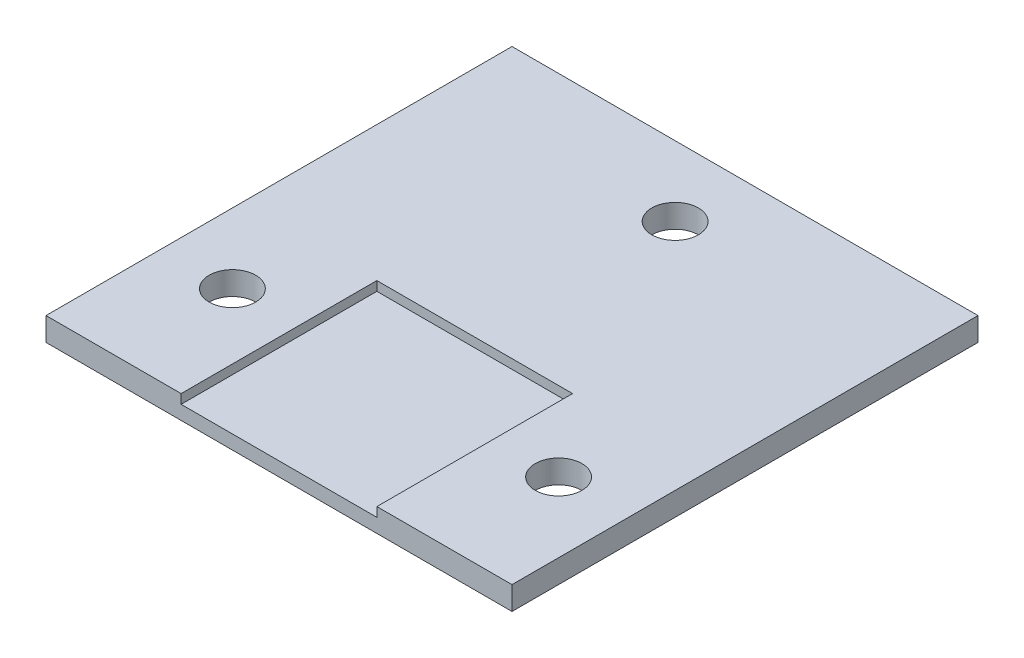
ISO-10303-21;
HEADER;
FILE_DESCRIPTION(('STEP AP214'),'2;1');
FILE_NAME('part.step','',(''),(''),'','','');
FILE_SCHEMA(('AUTOMOTIVE_DESIGN { 1 0 10303 214 1 1 1 1 }'));
ENDSEC;
DATA;
#1=APPLICATION_CONTEXT('core data for automotive mechanical design processes');
#2=APPLICATION_PROTOCOL_DEFINITION('international standard','automotive_design',2000,#1);
#3=PRODUCT_CONTEXT('',#1,'mechanical');
#4=PRODUCT('Part','Part','',(#3));
#5=PRODUCT_RELATED_PRODUCT_CATEGORY('part','',(#4));
#6=PRODUCT_DEFINITION_FORMATION('','',#4);
#7=PRODUCT_DEFINITION_CONTEXT('part definition',#1,'design');
#8=PRODUCT_DEFINITION('design','',#6,#7);
#9=PRODUCT_DEFINITION_SHAPE('','',#8);
#10=(LENGTH_UNIT() NAMED_UNIT(*) SI_UNIT(.MILLI.,.METRE.));
#11=(NAMED_UNIT(*) PLANE_ANGLE_UNIT() SI_UNIT($,.RADIAN.));
#12=(NAMED_UNIT(*) SI_UNIT($,.STERADIAN.) SOLID_ANGLE_UNIT());
#13=UNCERTAINTY_MEASURE_WITH_UNIT(LENGTH_MEASURE(1.E-05),#10,'distance_accuracy_value','');
#14=(GEOMETRIC_REPRESENTATION_CONTEXT(3) GLOBAL_UNCERTAINTY_ASSIGNED_CONTEXT((#13)) GLOBAL_UNIT_ASSIGNED_CONTEXT((#10,
#11,#12)) REPRESENTATION_CONTEXT('',''));
#15=CARTESIAN_POINT('',(0.,0.,0.));
#16=DIRECTION('',(0.,0.,1.));
#17=DIRECTION('',(1.,0.,0.));
#18=AXIS2_PLACEMENT_3D('',#15,#16,#17);
#19=CARTESIAN_POINT('',(50.,5.,50.));
#20=DIRECTION('',(-1.,0.,0.));
#21=DIRECTION('',(0.,0.,1.));
#22=AXIS2_PLACEMENT_3D('',#19,#20,#21);
#23=PLANE('',#22);
#24=DIRECTION('',(0.,0.,-1.));
#25=VECTOR('',#24,1.);
#26=CARTESIAN_POINT('',(50.,0.,50.));
#27=LINE('',#26,#25);
#28=CARTESIAN_POINT('',(50.,0.,50.));
#29=VERTEX_POINT('',#28);
#30=CARTESIAN_POINT('',(50.,0.,-50.));
#31=VERTEX_POINT('',#30);
#32=EDGE_CURVE('E157',#29,#31,#27,.T.);
#33=ORIENTED_EDGE('',*,*,#32,.T.);
#34=DIRECTION('',(0.,-1.,0.));
#35=VECTOR('',#34,1.);
#36=CARTESIAN_POINT('',(50.,5.,-50.));
#37=LINE('',#36,#35);
#38=CARTESIAN_POINT('',(50.,5.,-50.));
#39=VERTEX_POINT('',#38);
#40=EDGE_CURVE('E11',#39,#31,#37,.T.);
#41=ORIENTED_EDGE('',*,*,#40,.F.);
#42=DIRECTION('',(0.,0.,-1.));
#43=VECTOR('',#42,1.);
#44=CARTESIAN_POINT('',(50.,5.,50.));
#45=LINE('',#44,#43);
#46=CARTESIAN_POINT('',(50.,5.,50.));
#47=VERTEX_POINT('',#46);
#48=EDGE_CURVE('E164',#47,#39,#45,.T.);
#49=ORIENTED_EDGE('',*,*,#48,.F.);
#50=DIRECTION('',(0.,-1.,0.));
#51=VECTOR('',#50,1.);
#52=CARTESIAN_POINT('',(50.,5.,50.));
#53=LINE('',#52,#51);
#54=EDGE_CURVE('E176',#47,#29,#53,.T.);
#55=ORIENTED_EDGE('',*,*,#54,.T.);
#56=EDGE_LOOP('',(#33,#41,#49,#55));
#57=FACE_BOUND('',#56,.T.);
#58=ADVANCED_FACE('F39',(#57),#23,.F.);
#59=CARTESIAN_POINT('',(-50.,5.,-50.));
#60=DIRECTION('',(0.,0.,1.));
#61=DIRECTION('',(1.,0.,0.));
#62=AXIS2_PLACEMENT_3D('',#59,#60,#61);
#63=PLANE('',#62);
#64=DIRECTION('',(-1.,0.,0.));
#65=VECTOR('',#64,1.);
#66=CARTESIAN_POINT('',(-50.,0.,-50.));
#67=LINE('',#66,#65);
#68=CARTESIAN_POINT('',(-50.,0.,-50.));
#69=VERTEX_POINT('',#68);
#70=EDGE_CURVE('E180',#31,#69,#67,.T.);
#71=ORIENTED_EDGE('',*,*,#70,.T.);
#72=DIRECTION('',(0.,-1.,0.));
#73=VECTOR('',#72,1.);
#74=CARTESIAN_POINT('',(-50.,5.,-50.));
#75=LINE('',#74,#73);
#76=CARTESIAN_POINT('',(-50.,5.,-50.));
#77=VERTEX_POINT('',#76);
#78=EDGE_CURVE('E47',#77,#69,#75,.T.);
#79=ORIENTED_EDGE('',*,*,#78,.F.);
#80=DIRECTION('',(-1.,0.,0.));
#81=VECTOR('',#80,1.);
#82=CARTESIAN_POINT('',(-50.,5.,-50.));
#83=LINE('',#82,#81);
#84=EDGE_CURVE('E91',#39,#77,#83,.T.);
#85=ORIENTED_EDGE('',*,*,#84,.F.);
#86=ORIENTED_EDGE('',*,*,#40,.T.);
#87=EDGE_LOOP('',(#71,#79,#85,#86));
#88=FACE_BOUND('',#87,.T.);
#89=ADVANCED_FACE('F222',(#88),#63,.F.);
#90=CARTESIAN_POINT('',(-50.,5.,50.));
#91=DIRECTION('',(1.,0.,0.));
#92=DIRECTION('',(0.,0.,-1.));
#93=AXIS2_PLACEMENT_3D('',#90,#91,#92);
#94=PLANE('',#93);
#95=DIRECTION('',(0.,0.,1.));
#96=VECTOR('',#95,1.);
#97=CARTESIAN_POINT('',(-50.,0.,50.));
#98=LINE('',#97,#96);
#99=CARTESIAN_POINT('',(-50.,0.,50.));
#100=VERTEX_POINT('',#99);
#101=EDGE_CURVE('E183',#69,#100,#98,.T.);
#102=ORIENTED_EDGE('',*,*,#101,.T.);
#103=DIRECTION('',(0.,-1.,0.));
#104=VECTOR('',#103,1.);
#105=CARTESIAN_POINT('',(-50.,5.,50.));
#106=LINE('',#105,#104);
#107=CARTESIAN_POINT('',(-50.,5.,50.));
#108=VERTEX_POINT('',#107);
#109=EDGE_CURVE('E190',#108,#100,#106,.T.);
#110=ORIENTED_EDGE('',*,*,#109,.F.);
#111=DIRECTION('',(0.,0.,1.));
#112=VECTOR('',#111,1.);
#113=CARTESIAN_POINT('',(-50.,5.,50.));
#114=LINE('',#113,#112);
#115=EDGE_CURVE('E169',#77,#108,#114,.T.);
#116=ORIENTED_EDGE('',*,*,#115,.F.);
#117=ORIENTED_EDGE('',*,*,#78,.T.);
#118=EDGE_LOOP('',(#102,#110,#116,#117));
#119=FACE_BOUND('',#118,.T.);
#120=ADVANCED_FACE('F197',(#119),#94,.F.);
#121=CARTESIAN_POINT('',(-50.,5.,50.));
#122=DIRECTION('',(0.,0.,-1.));
#123=DIRECTION('',(-1.,0.,0.));
#124=AXIS2_PLACEMENT_3D('',#121,#122,#123);
#125=PLANE('',#124);
#126=DIRECTION('',(1.,0.,0.));
#127=VECTOR('',#126,1.);
#128=CARTESIAN_POINT('',(-50.,5.,50.));
#129=LINE('',#128,#127);
#130=CARTESIAN_POINT('',(21.,5.,50.));
#131=VERTEX_POINT('',#130);
#132=EDGE_CURVE('E62',#131,#47,#129,.T.);
#133=ORIENTED_EDGE('',*,*,#132,.F.);
#134=DIRECTION('',(0.,1.,0.));
#135=VECTOR('',#134,1.);
#136=CARTESIAN_POINT('',(21.,3.,50.));
#137=LINE('',#136,#135);
#138=CARTESIAN_POINT('',(21.,3.,50.));
#139=VERTEX_POINT('',#138);
#140=EDGE_CURVE('E154',#139,#131,#137,.T.);
#141=ORIENTED_EDGE('',*,*,#140,.F.);
#142=DIRECTION('',(1.,0.,0.));
#143=VECTOR('',#142,1.);
#144=CARTESIAN_POINT('',(-21.,3.,50.));
#145=LINE('',#144,#143);
#146=CARTESIAN_POINT('',(-21.,3.,50.));
#147=VERTEX_POINT('',#146);
#148=EDGE_CURVE('E121',#147,#139,#145,.T.);
#149=ORIENTED_EDGE('',*,*,#148,.F.);
#150=DIRECTION('',(0.,1.,0.));
#151=VECTOR('',#150,1.);
#152=CARTESIAN_POINT('',(-21.,3.,50.));
#153=LINE('',#152,#151);
#154=CARTESIAN_POINT('',(-21.,5.,50.));
#155=VERTEX_POINT('',#154);
#156=EDGE_CURVE('E158',#147,#155,#153,.T.);
#157=ORIENTED_EDGE('',*,*,#156,.T.);
#158=EDGE_CURVE('E172',#108,#155,#129,.T.);
#159=ORIENTED_EDGE('',*,*,#158,.F.);
#160=ORIENTED_EDGE('',*,*,#109,.T.);
#161=DIRECTION('',(1.,0.,0.));
#162=VECTOR('',#161,1.);
#163=CARTESIAN_POINT('',(-50.,0.,50.));
#164=LINE('',#163,#162);
#165=EDGE_CURVE('E84',#100,#29,#164,.T.);
#166=ORIENTED_EDGE('',*,*,#165,.T.);
#167=ORIENTED_EDGE('',*,*,#54,.F.);
#168=EDGE_LOOP('',(#133,#141,#149,#157,#159,#160,#166,#167));
#169=FACE_BOUND('',#168,.T.);
#170=ADVANCED_FACE('F205',(#169),#125,.F.);
#171=CARTESIAN_POINT('',(0.,5.,0.));
#172=DIRECTION('',(0.,-1.,0.));
#173=DIRECTION('',(0.,0.,-1.));
#174=AXIS2_PLACEMENT_3D('',#171,#172,#173);
#175=PLANE('',#174);
#176=CARTESIAN_POINT('',(0.,5.,-35.));
#177=DIRECTION('',(0.,1.,0.));
#178=DIRECTION('',(0.,0.,1.));
#179=AXIS2_PLACEMENT_3D('',#176,#177,#178);
#180=CIRCLE('',#179,5.);
#181=CARTESIAN_POINT('',(0.,5.,-30.));
#182=VERTEX_POINT('',#181);
#183=EDGE_CURVE('E243',#182,#182,#180,.T.);
#184=ORIENTED_EDGE('',*,*,#183,.F.);
#185=EDGE_LOOP('',(#184));
#186=FACE_BOUND('',#185,.T.);
#187=CARTESIAN_POINT('',(35.,5.,25.));
#188=DIRECTION('',(0.,1.,0.));
#189=DIRECTION('',(0.,0.,1.));
#190=AXIS2_PLACEMENT_3D('',#187,#188,#189);
#191=CIRCLE('',#190,5.);
#192=CARTESIAN_POINT('',(35.,5.,30.));
#193=VERTEX_POINT('',#192);
#194=EDGE_CURVE('E247',#193,#193,#191,.T.);
#195=ORIENTED_EDGE('',*,*,#194,.F.);
#196=EDGE_LOOP('',(#195));
#197=FACE_BOUND('',#196,.T.);
#198=CARTESIAN_POINT('',(-35.,5.,25.));
#199=DIRECTION('',(0.,1.,0.));
#200=DIRECTION('',(0.,0.,1.));
#201=AXIS2_PLACEMENT_3D('',#198,#199,#200);
#202=CIRCLE('',#201,5.);
#203=CARTESIAN_POINT('',(-35.,5.,30.));
#204=VERTEX_POINT('',#203);
#205=EDGE_CURVE('E250',#204,#204,#202,.T.);
#206=ORIENTED_EDGE('',*,*,#205,.F.);
#207=EDGE_LOOP('',(#206));
#208=FACE_BOUND('',#207,.T.);
#209=DIRECTION('',(-1.,0.,0.));
#210=VECTOR('',#209,1.);
#211=CARTESIAN_POINT('',(-21.,5.,7.99999999999999));
#212=LINE('',#211,#210);
#213=CARTESIAN_POINT('',(21.,5.,7.99999999999999));
#214=VERTEX_POINT('',#213);
#215=CARTESIAN_POINT('',(-21.,5.,7.99999999999999));
#216=VERTEX_POINT('',#215);
#217=EDGE_CURVE('E139',#214,#216,#212,.T.);
#218=ORIENTED_EDGE('',*,*,#217,.F.);
#219=DIRECTION('',(0.,0.,-1.));
#220=VECTOR('',#219,1.);
#221=CARTESIAN_POINT('',(21.,5.,7.99999999999999));
#222=LINE('',#221,#220);
#223=EDGE_CURVE('E54',#131,#214,#222,.T.);
#224=ORIENTED_EDGE('',*,*,#223,.F.);
#225=ORIENTED_EDGE('',*,*,#132,.T.);
#226=ORIENTED_EDGE('',*,*,#48,.T.);
#227=ORIENTED_EDGE('',*,*,#84,.T.);
#228=ORIENTED_EDGE('',*,*,#115,.T.);
#229=ORIENTED_EDGE('',*,*,#158,.T.);
#230=DIRECTION('',(0.,0.,1.));
#231=VECTOR('',#230,1.);
#232=CARTESIAN_POINT('',(-21.,5.,7.99999999999999));
#233=LINE('',#232,#231);
#234=EDGE_CURVE('E136',#216,#155,#233,.T.);
#235=ORIENTED_EDGE('',*,*,#234,.F.);
#236=EDGE_LOOP('',(#218,#224,#225,#226,#227,#228,#229,#235));
#237=FACE_BOUND('',#236,.T.);
#238=ADVANCED_FACE('F207',(#186,#197,#208,#237),#175,.F.);
#239=CARTESIAN_POINT('',(0.,0.,0.));
#240=DIRECTION('',(0.,-1.,0.));
#241=DIRECTION('',(0.,0.,-1.));
#242=AXIS2_PLACEMENT_3D('',#239,#240,#241);
#243=PLANE('',#242);
#244=CARTESIAN_POINT('',(0.,0.,-35.));
#245=DIRECTION('',(0.,1.,0.));
#246=DIRECTION('',(0.,0.,1.));
#247=AXIS2_PLACEMENT_3D('',#244,#245,#246);
#248=CIRCLE('',#247,5.);
#249=CARTESIAN_POINT('',(0.,0.,-30.));
#250=VERTEX_POINT('',#249);
#251=EDGE_CURVE('E151',#250,#250,#248,.T.);
#252=ORIENTED_EDGE('',*,*,#251,.T.);
#253=EDGE_LOOP('',(#252));
#254=FACE_BOUND('',#253,.T.);
#255=CARTESIAN_POINT('',(35.,0.,25.));
#256=DIRECTION('',(0.,1.,0.));
#257=DIRECTION('',(0.,0.,1.));
#258=AXIS2_PLACEMENT_3D('',#255,#256,#257);
#259=CIRCLE('',#258,5.);
#260=CARTESIAN_POINT('',(35.,0.,30.));
#261=VERTEX_POINT('',#260);
#262=EDGE_CURVE('E253',#261,#261,#259,.T.);
#263=ORIENTED_EDGE('',*,*,#262,.T.);
#264=EDGE_LOOP('',(#263));
#265=FACE_BOUND('',#264,.T.);
#266=CARTESIAN_POINT('',(-35.,0.,25.));
#267=DIRECTION('',(0.,1.,0.));
#268=DIRECTION('',(0.,0.,1.));
#269=AXIS2_PLACEMENT_3D('',#266,#267,#268);
#270=CIRCLE('',#269,5.);
#271=CARTESIAN_POINT('',(-35.,0.,30.));
#272=VERTEX_POINT('',#271);
#273=EDGE_CURVE('E142',#272,#272,#270,.T.);
#274=ORIENTED_EDGE('',*,*,#273,.T.);
#275=EDGE_LOOP('',(#274));
#276=FACE_BOUND('',#275,.T.);
#277=ORIENTED_EDGE('',*,*,#32,.F.);
#278=ORIENTED_EDGE('',*,*,#165,.F.);
#279=ORIENTED_EDGE('',*,*,#101,.F.);
#280=ORIENTED_EDGE('',*,*,#70,.F.);
#281=EDGE_LOOP('',(#277,#278,#279,#280));
#282=FACE_BOUND('',#281,.T.);
#283=ADVANCED_FACE('F201',(#254,#265,#276,#282),#243,.T.);
#284=CARTESIAN_POINT('',(21.,3.,7.99999999999999));
#285=DIRECTION('',(1.,0.,0.));
#286=DIRECTION('',(0.,0.,-1.));
#287=AXIS2_PLACEMENT_3D('',#284,#285,#286);
#288=PLANE('',#287);
#289=ORIENTED_EDGE('',*,*,#223,.T.);
#290=DIRECTION('',(0.,1.,0.));
#291=VECTOR('',#290,1.);
#292=CARTESIAN_POINT('',(21.,3.,7.99999999999999));
#293=LINE('',#292,#291);
#294=CARTESIAN_POINT('',(21.,3.,7.99999999999999));
#295=VERTEX_POINT('',#294);
#296=EDGE_CURVE('E110',#295,#214,#293,.T.);
#297=ORIENTED_EDGE('',*,*,#296,.F.);
#298=DIRECTION('',(0.,0.,-1.));
#299=VECTOR('',#298,1.);
#300=CARTESIAN_POINT('',(21.,3.,7.99999999999999));
#301=LINE('',#300,#299);
#302=EDGE_CURVE('E114',#139,#295,#301,.T.);
#303=ORIENTED_EDGE('',*,*,#302,.F.);
#304=ORIENTED_EDGE('',*,*,#140,.T.);
#305=EDGE_LOOP('',(#289,#297,#303,#304));
#306=FACE_BOUND('',#305,.T.);
#307=ADVANCED_FACE('F112',(#306),#288,.F.);
#308=CARTESIAN_POINT('',(-21.,3.,7.99999999999999));
#309=DIRECTION('',(-1.,0.,0.));
#310=DIRECTION('',(0.,0.,1.));
#311=AXIS2_PLACEMENT_3D('',#308,#309,#310);
#312=PLANE('',#311);
#313=ORIENTED_EDGE('',*,*,#234,.T.);
#314=ORIENTED_EDGE('',*,*,#156,.F.);
#315=DIRECTION('',(0.,0.,1.));
#316=VECTOR('',#315,1.);
#317=CARTESIAN_POINT('',(-21.,3.,7.99999999999999));
#318=LINE('',#317,#316);
#319=CARTESIAN_POINT('',(-21.,3.,7.99999999999999));
#320=VERTEX_POINT('',#319);
#321=EDGE_CURVE('E130',#320,#147,#318,.T.);
#322=ORIENTED_EDGE('',*,*,#321,.F.);
#323=DIRECTION('',(0.,1.,0.));
#324=VECTOR('',#323,1.);
#325=CARTESIAN_POINT('',(-21.,3.,7.99999999999999));
#326=LINE('',#325,#324);
#327=EDGE_CURVE('E120',#320,#216,#326,.T.);
#328=ORIENTED_EDGE('',*,*,#327,.T.);
#329=EDGE_LOOP('',(#313,#314,#322,#328));
#330=FACE_BOUND('',#329,.T.);
#331=ADVANCED_FACE('F211',(#330),#312,.F.);
#332=CARTESIAN_POINT('',(-21.,3.,7.99999999999999));
#333=DIRECTION('',(0.,0.,-1.));
#334=DIRECTION('',(-1.,0.,0.));
#335=AXIS2_PLACEMENT_3D('',#332,#333,#334);
#336=PLANE('',#335);
#337=ORIENTED_EDGE('',*,*,#217,.T.);
#338=ORIENTED_EDGE('',*,*,#327,.F.);
#339=DIRECTION('',(-1.,0.,0.));
#340=VECTOR('',#339,1.);
#341=CARTESIAN_POINT('',(-21.,3.,7.99999999999999));
#342=LINE('',#341,#340);
#343=EDGE_CURVE('E124',#295,#320,#342,.T.);
#344=ORIENTED_EDGE('',*,*,#343,.F.);
#345=ORIENTED_EDGE('',*,*,#296,.T.);
#346=EDGE_LOOP('',(#337,#338,#344,#345));
#347=FACE_BOUND('',#346,.T.);
#348=ADVANCED_FACE('F125',(#347),#336,.F.);
#349=CARTESIAN_POINT('',(0.,3.,0.));
#350=DIRECTION('',(0.,1.,0.));
#351=DIRECTION('',(0.,0.,1.));
#352=AXIS2_PLACEMENT_3D('',#349,#350,#351);
#353=PLANE('',#352);
#354=ORIENTED_EDGE('',*,*,#302,.T.);
#355=ORIENTED_EDGE('',*,*,#343,.T.);
#356=ORIENTED_EDGE('',*,*,#321,.T.);
#357=ORIENTED_EDGE('',*,*,#148,.T.);
#358=EDGE_LOOP('',(#354,#355,#356,#357));
#359=FACE_BOUND('',#358,.T.);
#360=ADVANCED_FACE('F132',(#359),#353,.T.);
#361=CARTESIAN_POINT('',(-35.,0.,25.));
#362=DIRECTION('',(0.,1.,0.));
#363=DIRECTION('',(0.,0.,1.));
#364=AXIS2_PLACEMENT_3D('',#361,#362,#363);
#365=CYLINDRICAL_SURFACE('',#364,5.);
#366=ORIENTED_EDGE('',*,*,#273,.F.);
#367=EDGE_LOOP('',(#366));
#368=FACE_BOUND('',#367,.T.);
#369=ORIENTED_EDGE('',*,*,#205,.T.);
#370=EDGE_LOOP('',(#369));
#371=FACE_BOUND('',#370,.T.);
#372=ADVANCED_FACE('F277',(#368,#371),#365,.F.);
#373=CARTESIAN_POINT('',(35.,0.,25.));
#374=DIRECTION('',(0.,1.,0.));
#375=DIRECTION('',(0.,0.,1.));
#376=AXIS2_PLACEMENT_3D('',#373,#374,#375);
#377=CYLINDRICAL_SURFACE('',#376,5.);
#378=ORIENTED_EDGE('',*,*,#262,.F.);
#379=EDGE_LOOP('',(#378));
#380=FACE_BOUND('',#379,.T.);
#381=ORIENTED_EDGE('',*,*,#194,.T.);
#382=EDGE_LOOP('',(#381));
#383=FACE_BOUND('',#382,.T.);
#384=ADVANCED_FACE('F272',(#380,#383),#377,.F.);
#385=CARTESIAN_POINT('',(0.,0.,-35.));
#386=DIRECTION('',(0.,1.,0.));
#387=DIRECTION('',(0.,0.,1.));
#388=AXIS2_PLACEMENT_3D('',#385,#386,#387);
#389=CYLINDRICAL_SURFACE('',#388,5.);
#390=ORIENTED_EDGE('',*,*,#251,.F.);
#391=EDGE_LOOP('',(#390));
#392=FACE_BOUND('',#391,.T.);
#393=ORIENTED_EDGE('',*,*,#183,.T.);
#394=EDGE_LOOP('',(#393));
#395=FACE_BOUND('',#394,.T.);
#396=ADVANCED_FACE('F269',(#392,#395),#389,.F.);
#397=CLOSED_SHELL('',(#58,#89,#120,#170,#238,#283,#307,#331,#348,#360,#372,#384,#396));
#398=MANIFOLD_SOLID_BREP('B2',#397);
#399=ADVANCED_BREP_SHAPE_REPRESENTATION('',(#18,#398),#14);
#400=SHAPE_DEFINITION_REPRESENTATION(#9,#399);
ENDSEC;
END-ISO-10303-21;
